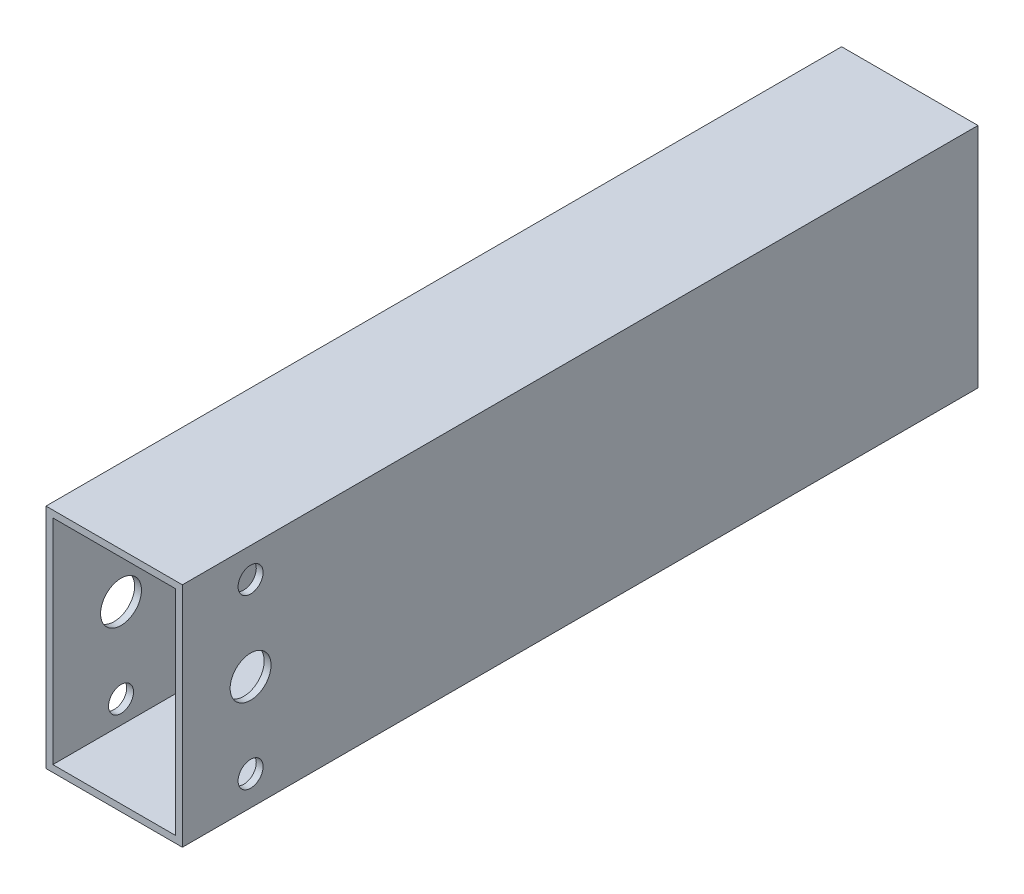
ISO-10303-21;
HEADER;
FILE_DESCRIPTION(('STEP AP214'),'2;1');
FILE_NAME('part.step','',(''),(''),'','','');
FILE_SCHEMA(('AUTOMOTIVE_DESIGN { 1 0 10303 214 1 1 1 1 }'));
ENDSEC;
DATA;
#1=APPLICATION_CONTEXT('core data for automotive mechanical design processes');
#2=APPLICATION_PROTOCOL_DEFINITION('international standard','automotive_design',2000,#1);
#3=PRODUCT_CONTEXT('',#1,'mechanical');
#4=PRODUCT('Part','Part','',(#3));
#5=PRODUCT_RELATED_PRODUCT_CATEGORY('part','',(#4));
#6=PRODUCT_DEFINITION_FORMATION('','',#4);
#7=PRODUCT_DEFINITION_CONTEXT('part definition',#1,'design');
#8=PRODUCT_DEFINITION('design','',#6,#7);
#9=PRODUCT_DEFINITION_SHAPE('','',#8);
#10=(LENGTH_UNIT() NAMED_UNIT(*) SI_UNIT(.MILLI.,.METRE.));
#11=(NAMED_UNIT(*) PLANE_ANGLE_UNIT() SI_UNIT($,.RADIAN.));
#12=(NAMED_UNIT(*) SI_UNIT($,.STERADIAN.) SOLID_ANGLE_UNIT());
#13=UNCERTAINTY_MEASURE_WITH_UNIT(LENGTH_MEASURE(1.E-05),#10,'distance_accuracy_value','');
#14=(GEOMETRIC_REPRESENTATION_CONTEXT(3) GLOBAL_UNCERTAINTY_ASSIGNED_CONTEXT((#13)) GLOBAL_UNIT_ASSIGNED_CONTEXT((#10,
#11,#12)) REPRESENTATION_CONTEXT('',''));
#15=CARTESIAN_POINT('',(0.,0.,0.));
#16=DIRECTION('',(0.,0.,1.));
#17=DIRECTION('',(1.,0.,0.));
#18=AXIS2_PLACEMENT_3D('',#15,#16,#17);
#19=CARTESIAN_POINT('',(0.,0.,175.));
#20=DIRECTION('',(0.,0.,-1.));
#21=DIRECTION('',(-1.,0.,0.));
#22=AXIS2_PLACEMENT_3D('',#19,#20,#21);
#23=PLANE('',#22);
#24=DIRECTION('',(0.,-1.,0.));
#25=VECTOR('',#24,1.);
#26=CARTESIAN_POINT('',(0.,0.,175.));
#27=LINE('',#26,#25);
#28=CARTESIAN_POINT('',(0.,50.,175.));
#29=VERTEX_POINT('',#28);
#30=CARTESIAN_POINT('',(0.,0.,175.));
#31=VERTEX_POINT('',#30);
#32=EDGE_CURVE('E140',#29,#31,#27,.T.);
#33=ORIENTED_EDGE('',*,*,#32,.T.);
#34=DIRECTION('',(1.,0.,0.));
#35=VECTOR('',#34,1.);
#36=CARTESIAN_POINT('',(0.,0.,175.));
#37=LINE('',#36,#35);
#38=CARTESIAN_POINT('',(30.,0.,175.));
#39=VERTEX_POINT('',#38);
#40=EDGE_CURVE('E143',#31,#39,#37,.T.);
#41=ORIENTED_EDGE('',*,*,#40,.T.);
#42=DIRECTION('',(0.,1.,0.));
#43=VECTOR('',#42,1.);
#44=CARTESIAN_POINT('',(30.,0.,175.));
#45=LINE('',#44,#43);
#46=CARTESIAN_POINT('',(30.,50.,175.));
#47=VERTEX_POINT('',#46);
#48=EDGE_CURVE('E146',#39,#47,#45,.T.);
#49=ORIENTED_EDGE('',*,*,#48,.T.);
#50=DIRECTION('',(-1.,0.,0.));
#51=VECTOR('',#50,1.);
#52=CARTESIAN_POINT('',(0.,50.,175.));
#53=LINE('',#52,#51);
#54=EDGE_CURVE('E148',#47,#29,#53,.T.);
#55=ORIENTED_EDGE('',*,*,#54,.T.);
#56=EDGE_LOOP('',(#33,#41,#49,#55));
#57=FACE_BOUND('',#56,.T.);
#58=DIRECTION('',(0.,-1.,0.));
#59=VECTOR('',#58,1.);
#60=CARTESIAN_POINT('',(1.5,1.5,175.));
#61=LINE('',#60,#59);
#62=CARTESIAN_POINT('',(1.5,48.5,175.));
#63=VERTEX_POINT('',#62);
#64=CARTESIAN_POINT('',(1.5,1.5,175.));
#65=VERTEX_POINT('',#64);
#66=EDGE_CURVE('E102',#63,#65,#61,.T.);
#67=ORIENTED_EDGE('',*,*,#66,.F.);
#68=DIRECTION('',(-1.,0.,0.));
#69=VECTOR('',#68,1.);
#70=CARTESIAN_POINT('',(1.5,48.5,175.));
#71=LINE('',#70,#69);
#72=CARTESIAN_POINT('',(28.5,48.5,175.));
#73=VERTEX_POINT('',#72);
#74=EDGE_CURVE('E124',#73,#63,#71,.T.);
#75=ORIENTED_EDGE('',*,*,#74,.F.);
#76=DIRECTION('',(0.,1.,0.));
#77=VECTOR('',#76,1.);
#78=CARTESIAN_POINT('',(28.5,1.5,175.));
#79=LINE('',#78,#77);
#80=CARTESIAN_POINT('',(28.5,1.5,175.));
#81=VERTEX_POINT('',#80);
#82=EDGE_CURVE('E122',#81,#73,#79,.T.);
#83=ORIENTED_EDGE('',*,*,#82,.F.);
#84=DIRECTION('',(1.,0.,0.));
#85=VECTOR('',#84,1.);
#86=CARTESIAN_POINT('',(1.5,1.5,175.));
#87=LINE('',#86,#85);
#88=EDGE_CURVE('E110',#65,#81,#87,.T.);
#89=ORIENTED_EDGE('',*,*,#88,.F.);
#90=EDGE_LOOP('',(#67,#75,#83,#89));
#91=FACE_BOUND('',#90,.T.);
#92=ADVANCED_FACE('F35',(#57,#91),#23,.F.);
#93=CARTESIAN_POINT('',(0.,0.,0.));
#94=DIRECTION('',(0.,0.,-1.));
#95=DIRECTION('',(-1.,0.,0.));
#96=AXIS2_PLACEMENT_3D('',#93,#94,#95);
#97=PLANE('',#96);
#98=DIRECTION('',(0.,-1.,0.));
#99=VECTOR('',#98,1.);
#100=CARTESIAN_POINT('',(0.,0.,0.));
#101=LINE('',#100,#99);
#102=CARTESIAN_POINT('',(0.,50.,0.));
#103=VERTEX_POINT('',#102);
#104=CARTESIAN_POINT('',(0.,0.,0.));
#105=VERTEX_POINT('',#104);
#106=EDGE_CURVE('E118',#103,#105,#101,.T.);
#107=ORIENTED_EDGE('',*,*,#106,.F.);
#108=DIRECTION('',(-1.,0.,0.));
#109=VECTOR('',#108,1.);
#110=CARTESIAN_POINT('',(0.,50.,0.));
#111=LINE('',#110,#109);
#112=CARTESIAN_POINT('',(30.,50.,0.));
#113=VERTEX_POINT('',#112);
#114=EDGE_CURVE('E144',#113,#103,#111,.T.);
#115=ORIENTED_EDGE('',*,*,#114,.F.);
#116=DIRECTION('',(0.,1.,0.));
#117=VECTOR('',#116,1.);
#118=CARTESIAN_POINT('',(30.,0.,0.));
#119=LINE('',#118,#117);
#120=CARTESIAN_POINT('',(30.,0.,0.));
#121=VERTEX_POINT('',#120);
#122=EDGE_CURVE('E155',#121,#113,#119,.T.);
#123=ORIENTED_EDGE('',*,*,#122,.F.);
#124=DIRECTION('',(1.,0.,0.));
#125=VECTOR('',#124,1.);
#126=CARTESIAN_POINT('',(0.,0.,0.));
#127=LINE('',#126,#125);
#128=EDGE_CURVE('E153',#105,#121,#127,.T.);
#129=ORIENTED_EDGE('',*,*,#128,.F.);
#130=EDGE_LOOP('',(#107,#115,#123,#129));
#131=FACE_BOUND('',#130,.T.);
#132=DIRECTION('',(-1.,0.,0.));
#133=VECTOR('',#132,1.);
#134=CARTESIAN_POINT('',(1.5,48.5,0.));
#135=LINE('',#134,#133);
#136=CARTESIAN_POINT('',(28.5,48.5,0.));
#137=VERTEX_POINT('',#136);
#138=CARTESIAN_POINT('',(1.5,48.5,0.));
#139=VERTEX_POINT('',#138);
#140=EDGE_CURVE('E111',#137,#139,#135,.T.);
#141=ORIENTED_EDGE('',*,*,#140,.T.);
#142=DIRECTION('',(0.,-1.,0.));
#143=VECTOR('',#142,1.);
#144=CARTESIAN_POINT('',(1.5,1.5,0.));
#145=LINE('',#144,#143);
#146=CARTESIAN_POINT('',(1.5,1.5,0.));
#147=VERTEX_POINT('',#146);
#148=EDGE_CURVE('E60',#139,#147,#145,.T.);
#149=ORIENTED_EDGE('',*,*,#148,.T.);
#150=DIRECTION('',(1.,0.,0.));
#151=VECTOR('',#150,1.);
#152=CARTESIAN_POINT('',(1.5,1.5,0.));
#153=LINE('',#152,#151);
#154=CARTESIAN_POINT('',(28.5,1.5,0.));
#155=VERTEX_POINT('',#154);
#156=EDGE_CURVE('E117',#147,#155,#153,.T.);
#157=ORIENTED_EDGE('',*,*,#156,.T.);
#158=DIRECTION('',(0.,1.,0.));
#159=VECTOR('',#158,1.);
#160=CARTESIAN_POINT('',(28.5,1.5,0.));
#161=LINE('',#160,#159);
#162=EDGE_CURVE('E132',#155,#137,#161,.T.);
#163=ORIENTED_EDGE('',*,*,#162,.T.);
#164=EDGE_LOOP('',(#141,#149,#157,#163));
#165=FACE_BOUND('',#164,.T.);
#166=ADVANCED_FACE('F213',(#131,#165),#97,.T.);
#167=CARTESIAN_POINT('',(0.,0.,175.));
#168=DIRECTION('',(1.,0.,0.));
#169=DIRECTION('',(0.,0.,-1.));
#170=AXIS2_PLACEMENT_3D('',#167,#168,#169);
#171=PLANE('',#170);
#172=CARTESIAN_POINT('',(0.,25.,160.));
#173=DIRECTION('',(1.,0.,0.));
#174=DIRECTION('',(0.,0.,-1.));
#175=AXIS2_PLACEMENT_3D('',#172,#173,#174);
#176=CIRCLE('',#175,4.49999999999999);
#177=CARTESIAN_POINT('',(0.,25.,155.5));
#178=VERTEX_POINT('',#177);
#179=EDGE_CURVE('E277',#178,#178,#176,.T.);
#180=ORIENTED_EDGE('',*,*,#179,.T.);
#181=EDGE_LOOP('',(#180));
#182=FACE_BOUND('',#181,.T.);
#183=CARTESIAN_POINT('',(0.,43.5,160.));
#184=DIRECTION('',(1.,0.,0.));
#185=DIRECTION('',(0.,0.,-1.));
#186=AXIS2_PLACEMENT_3D('',#183,#184,#185);
#187=CIRCLE('',#186,2.75);
#188=CARTESIAN_POINT('',(0.,43.5,157.25));
#189=VERTEX_POINT('',#188);
#190=EDGE_CURVE('E171',#189,#189,#187,.T.);
#191=ORIENTED_EDGE('',*,*,#190,.T.);
#192=EDGE_LOOP('',(#191));
#193=FACE_BOUND('',#192,.T.);
#194=CARTESIAN_POINT('',(0.,6.50000000000001,160.));
#195=DIRECTION('',(1.,0.,0.));
#196=DIRECTION('',(0.,0.,-1.));
#197=AXIS2_PLACEMENT_3D('',#194,#195,#196);
#198=CIRCLE('',#197,2.74999999999999);
#199=CARTESIAN_POINT('',(0.,6.50000000000001,157.25));
#200=VERTEX_POINT('',#199);
#201=EDGE_CURVE('E167',#200,#200,#198,.T.);
#202=ORIENTED_EDGE('',*,*,#201,.T.);
#203=EDGE_LOOP('',(#202));
#204=FACE_BOUND('',#203,.T.);
#205=ORIENTED_EDGE('',*,*,#106,.T.);
#206=DIRECTION('',(0.,0.,-1.));
#207=VECTOR('',#206,1.);
#208=CARTESIAN_POINT('',(0.,0.,175.));
#209=LINE('',#208,#207);
#210=EDGE_CURVE('E11',#31,#105,#209,.T.);
#211=ORIENTED_EDGE('',*,*,#210,.F.);
#212=ORIENTED_EDGE('',*,*,#32,.F.);
#213=DIRECTION('',(0.,0.,-1.));
#214=VECTOR('',#213,1.);
#215=CARTESIAN_POINT('',(0.,50.,175.));
#216=LINE('',#215,#214);
#217=EDGE_CURVE('E150',#29,#103,#216,.T.);
#218=ORIENTED_EDGE('',*,*,#217,.T.);
#219=EDGE_LOOP('',(#205,#211,#212,#218));
#220=FACE_BOUND('',#219,.T.);
#221=ADVANCED_FACE('F37',(#182,#193,#204,#220),#171,.F.);
#222=CARTESIAN_POINT('',(0.,0.,175.));
#223=DIRECTION('',(0.,1.,0.));
#224=DIRECTION('',(0.,0.,1.));
#225=AXIS2_PLACEMENT_3D('',#222,#223,#224);
#226=PLANE('',#225);
#227=ORIENTED_EDGE('',*,*,#128,.T.);
#228=DIRECTION('',(0.,0.,-1.));
#229=VECTOR('',#228,1.);
#230=CARTESIAN_POINT('',(30.,0.,175.));
#231=LINE('',#230,#229);
#232=EDGE_CURVE('E44',#39,#121,#231,.T.);
#233=ORIENTED_EDGE('',*,*,#232,.F.);
#234=ORIENTED_EDGE('',*,*,#40,.F.);
#235=ORIENTED_EDGE('',*,*,#210,.T.);
#236=EDGE_LOOP('',(#227,#233,#234,#235));
#237=FACE_BOUND('',#236,.T.);
#238=ADVANCED_FACE('F222',(#237),#226,.F.);
#239=CARTESIAN_POINT('',(30.,0.,175.));
#240=DIRECTION('',(-1.,0.,0.));
#241=DIRECTION('',(0.,0.,1.));
#242=AXIS2_PLACEMENT_3D('',#239,#240,#241);
#243=PLANE('',#242);
#244=CARTESIAN_POINT('',(30.,25.,160.));
#245=DIRECTION('',(1.,0.,0.));
#246=DIRECTION('',(0.,0.,-1.));
#247=AXIS2_PLACEMENT_3D('',#244,#245,#246);
#248=CIRCLE('',#247,4.5);
#249=CARTESIAN_POINT('',(30.,25.,155.5));
#250=VERTEX_POINT('',#249);
#251=EDGE_CURVE('E276',#250,#250,#248,.T.);
#252=ORIENTED_EDGE('',*,*,#251,.F.);
#253=EDGE_LOOP('',(#252));
#254=FACE_BOUND('',#253,.T.);
#255=CARTESIAN_POINT('',(30.,43.5,160.));
#256=DIRECTION('',(1.,0.,0.));
#257=DIRECTION('',(0.,0.,-1.));
#258=AXIS2_PLACEMENT_3D('',#255,#256,#257);
#259=CIRCLE('',#258,2.75);
#260=CARTESIAN_POINT('',(30.,43.5,157.25));
#261=VERTEX_POINT('',#260);
#262=EDGE_CURVE('E178',#261,#261,#259,.T.);
#263=ORIENTED_EDGE('',*,*,#262,.F.);
#264=EDGE_LOOP('',(#263));
#265=FACE_BOUND('',#264,.T.);
#266=CARTESIAN_POINT('',(30.,6.50000000000001,160.));
#267=DIRECTION('',(1.,0.,0.));
#268=DIRECTION('',(0.,0.,-1.));
#269=AXIS2_PLACEMENT_3D('',#266,#267,#268);
#270=CIRCLE('',#269,2.75);
#271=CARTESIAN_POINT('',(30.,6.50000000000001,157.25));
#272=VERTEX_POINT('',#271);
#273=EDGE_CURVE('E175',#272,#272,#270,.T.);
#274=ORIENTED_EDGE('',*,*,#273,.F.);
#275=EDGE_LOOP('',(#274));
#276=FACE_BOUND('',#275,.T.);
#277=ORIENTED_EDGE('',*,*,#122,.T.);
#278=DIRECTION('',(0.,0.,-1.));
#279=VECTOR('',#278,1.);
#280=CARTESIAN_POINT('',(30.,50.,175.));
#281=LINE('',#280,#279);
#282=EDGE_CURVE('E160',#47,#113,#281,.T.);
#283=ORIENTED_EDGE('',*,*,#282,.F.);
#284=ORIENTED_EDGE('',*,*,#48,.F.);
#285=ORIENTED_EDGE('',*,*,#232,.T.);
#286=EDGE_LOOP('',(#277,#283,#284,#285));
#287=FACE_BOUND('',#286,.T.);
#288=ADVANCED_FACE('F206',(#254,#265,#276,#287),#243,.F.);
#289=CARTESIAN_POINT('',(0.,50.,175.));
#290=DIRECTION('',(0.,-1.,0.));
#291=DIRECTION('',(0.,0.,-1.));
#292=AXIS2_PLACEMENT_3D('',#289,#290,#291);
#293=PLANE('',#292);
#294=ORIENTED_EDGE('',*,*,#114,.T.);
#295=ORIENTED_EDGE('',*,*,#217,.F.);
#296=ORIENTED_EDGE('',*,*,#54,.F.);
#297=ORIENTED_EDGE('',*,*,#282,.T.);
#298=EDGE_LOOP('',(#294,#295,#296,#297));
#299=FACE_BOUND('',#298,.T.);
#300=ADVANCED_FACE('F197',(#299),#293,.F.);
#301=CARTESIAN_POINT('',(1.5,1.5,175.));
#302=DIRECTION('',(1.,0.,0.));
#303=DIRECTION('',(0.,0.,-1.));
#304=AXIS2_PLACEMENT_3D('',#301,#302,#303);
#305=PLANE('',#304);
#306=CARTESIAN_POINT('',(1.5,25.,160.));
#307=DIRECTION('',(1.,0.,0.));
#308=DIRECTION('',(0.,0.,-1.));
#309=AXIS2_PLACEMENT_3D('',#306,#307,#308);
#310=CIRCLE('',#309,4.5);
#311=CARTESIAN_POINT('',(1.5,25.,155.5));
#312=VERTEX_POINT('',#311);
#313=EDGE_CURVE('E183',#312,#312,#310,.T.);
#314=ORIENTED_EDGE('',*,*,#313,.F.);
#315=EDGE_LOOP('',(#314));
#316=FACE_BOUND('',#315,.T.);
#317=CARTESIAN_POINT('',(1.5,43.5,160.));
#318=DIRECTION('',(1.,0.,0.));
#319=DIRECTION('',(0.,0.,-1.));
#320=AXIS2_PLACEMENT_3D('',#317,#318,#319);
#321=CIRCLE('',#320,2.75);
#322=CARTESIAN_POINT('',(1.5,43.5,157.25));
#323=VERTEX_POINT('',#322);
#324=EDGE_CURVE('E168',#323,#323,#321,.T.);
#325=ORIENTED_EDGE('',*,*,#324,.F.);
#326=EDGE_LOOP('',(#325));
#327=FACE_BOUND('',#326,.T.);
#328=CARTESIAN_POINT('',(1.5,6.50000000000001,160.));
#329=DIRECTION('',(1.,0.,0.));
#330=DIRECTION('',(0.,0.,-1.));
#331=AXIS2_PLACEMENT_3D('',#328,#329,#330);
#332=CIRCLE('',#331,2.74999999999999);
#333=CARTESIAN_POINT('',(1.5,6.50000000000001,157.25));
#334=VERTEX_POINT('',#333);
#335=EDGE_CURVE('E130',#334,#334,#332,.T.);
#336=ORIENTED_EDGE('',*,*,#335,.F.);
#337=EDGE_LOOP('',(#336));
#338=FACE_BOUND('',#337,.T.);
#339=ORIENTED_EDGE('',*,*,#148,.F.);
#340=DIRECTION('',(0.,0.,-1.));
#341=VECTOR('',#340,1.);
#342=CARTESIAN_POINT('',(1.5,48.5,175.));
#343=LINE('',#342,#341);
#344=EDGE_CURVE('E106',#63,#139,#343,.T.);
#345=ORIENTED_EDGE('',*,*,#344,.F.);
#346=ORIENTED_EDGE('',*,*,#66,.T.);
#347=DIRECTION('',(0.,0.,-1.));
#348=VECTOR('',#347,1.);
#349=CARTESIAN_POINT('',(1.5,1.5,175.));
#350=LINE('',#349,#348);
#351=EDGE_CURVE('E105',#65,#147,#350,.T.);
#352=ORIENTED_EDGE('',*,*,#351,.T.);
#353=EDGE_LOOP('',(#339,#345,#346,#352));
#354=FACE_BOUND('',#353,.T.);
#355=ADVANCED_FACE('F104',(#316,#327,#338,#354),#305,.T.);
#356=CARTESIAN_POINT('',(1.5,1.5,175.));
#357=DIRECTION('',(0.,1.,0.));
#358=DIRECTION('',(-1.,0.,0.));
#359=AXIS2_PLACEMENT_3D('',#356,#357,#358);
#360=PLANE('',#359);
#361=ORIENTED_EDGE('',*,*,#156,.F.);
#362=ORIENTED_EDGE('',*,*,#351,.F.);
#363=ORIENTED_EDGE('',*,*,#88,.T.);
#364=DIRECTION('',(0.,0.,-1.));
#365=VECTOR('',#364,1.);
#366=CARTESIAN_POINT('',(28.5,1.5,175.));
#367=LINE('',#366,#365);
#368=EDGE_CURVE('E119',#81,#155,#367,.T.);
#369=ORIENTED_EDGE('',*,*,#368,.T.);
#370=EDGE_LOOP('',(#361,#362,#363,#369));
#371=FACE_BOUND('',#370,.T.);
#372=ADVANCED_FACE('F114',(#371),#360,.T.);
#373=CARTESIAN_POINT('',(28.5,1.5,175.));
#374=DIRECTION('',(-1.,0.,0.));
#375=DIRECTION('',(0.,0.,1.));
#376=AXIS2_PLACEMENT_3D('',#373,#374,#375);
#377=PLANE('',#376);
#378=CARTESIAN_POINT('',(28.5,25.,160.));
#379=DIRECTION('',(-1.,0.,0.));
#380=DIRECTION('',(0.,0.,1.));
#381=AXIS2_PLACEMENT_3D('',#378,#379,#380);
#382=CIRCLE('',#381,4.5);
#383=CARTESIAN_POINT('',(28.5,25.,164.5));
#384=VERTEX_POINT('',#383);
#385=EDGE_CURVE('E39',#384,#384,#382,.T.);
#386=ORIENTED_EDGE('',*,*,#385,.F.);
#387=EDGE_LOOP('',(#386));
#388=FACE_BOUND('',#387,.T.);
#389=CARTESIAN_POINT('',(28.5,43.5,160.));
#390=DIRECTION('',(-1.,0.,0.));
#391=DIRECTION('',(0.,0.,1.));
#392=AXIS2_PLACEMENT_3D('',#389,#390,#391);
#393=CIRCLE('',#392,2.75);
#394=CARTESIAN_POINT('',(28.5,43.5,162.75));
#395=VERTEX_POINT('',#394);
#396=EDGE_CURVE('E170',#395,#395,#393,.T.);
#397=ORIENTED_EDGE('',*,*,#396,.F.);
#398=EDGE_LOOP('',(#397));
#399=FACE_BOUND('',#398,.T.);
#400=CARTESIAN_POINT('',(28.5,6.50000000000001,160.));
#401=DIRECTION('',(-1.,0.,0.));
#402=DIRECTION('',(0.,0.,1.));
#403=AXIS2_PLACEMENT_3D('',#400,#401,#402);
#404=CIRCLE('',#403,2.74999999999999);
#405=CARTESIAN_POINT('',(28.5,6.50000000000001,162.75));
#406=VERTEX_POINT('',#405);
#407=EDGE_CURVE('E165',#406,#406,#404,.T.);
#408=ORIENTED_EDGE('',*,*,#407,.F.);
#409=EDGE_LOOP('',(#408));
#410=FACE_BOUND('',#409,.T.);
#411=ORIENTED_EDGE('',*,*,#162,.F.);
#412=ORIENTED_EDGE('',*,*,#368,.F.);
#413=ORIENTED_EDGE('',*,*,#82,.T.);
#414=DIRECTION('',(0.,0.,-1.));
#415=VECTOR('',#414,1.);
#416=CARTESIAN_POINT('',(28.5,48.5,175.));
#417=LINE('',#416,#415);
#418=EDGE_CURVE('E52',#73,#137,#417,.T.);
#419=ORIENTED_EDGE('',*,*,#418,.T.);
#420=EDGE_LOOP('',(#411,#412,#413,#419));
#421=FACE_BOUND('',#420,.T.);
#422=ADVANCED_FACE('F204',(#388,#399,#410,#421),#377,.T.);
#423=CARTESIAN_POINT('',(1.5,48.5,175.));
#424=DIRECTION('',(0.,-1.,0.));
#425=DIRECTION('',(0.,0.,-1.));
#426=AXIS2_PLACEMENT_3D('',#423,#424,#425);
#427=PLANE('',#426);
#428=ORIENTED_EDGE('',*,*,#140,.F.);
#429=ORIENTED_EDGE('',*,*,#418,.F.);
#430=ORIENTED_EDGE('',*,*,#74,.T.);
#431=ORIENTED_EDGE('',*,*,#344,.T.);
#432=EDGE_LOOP('',(#428,#429,#430,#431));
#433=FACE_BOUND('',#432,.T.);
#434=ADVANCED_FACE('F244',(#433),#427,.T.);
#435=CARTESIAN_POINT('',(30.,6.50000000000001,160.));
#436=DIRECTION('',(1.,0.,0.));
#437=DIRECTION('',(0.,0.,-1.));
#438=AXIS2_PLACEMENT_3D('',#435,#436,#437);
#439=CYLINDRICAL_SURFACE('',#438,2.74999999999999);
#440=ORIENTED_EDGE('',*,*,#407,.T.);
#441=EDGE_LOOP('',(#440));
#442=FACE_BOUND('',#441,.T.);
#443=ORIENTED_EDGE('',*,*,#273,.T.);
#444=EDGE_LOOP('',(#443));
#445=FACE_BOUND('',#444,.T.);
#446=ADVANCED_FACE('F246',(#442,#445),#439,.F.);
#447=ORIENTED_EDGE('',*,*,#335,.T.);
#448=EDGE_LOOP('',(#447));
#449=FACE_BOUND('',#448,.T.);
#450=ORIENTED_EDGE('',*,*,#201,.F.);
#451=EDGE_LOOP('',(#450));
#452=FACE_BOUND('',#451,.T.);
#453=ADVANCED_FACE('F193',(#449,#452),#439,.F.);
#454=CARTESIAN_POINT('',(30.,43.5,160.));
#455=DIRECTION('',(1.,0.,0.));
#456=DIRECTION('',(0.,0.,-1.));
#457=AXIS2_PLACEMENT_3D('',#454,#455,#456);
#458=CYLINDRICAL_SURFACE('',#457,2.75);
#459=ORIENTED_EDGE('',*,*,#324,.T.);
#460=EDGE_LOOP('',(#459));
#461=FACE_BOUND('',#460,.T.);
#462=ORIENTED_EDGE('',*,*,#190,.F.);
#463=EDGE_LOOP('',(#462));
#464=FACE_BOUND('',#463,.T.);
#465=ADVANCED_FACE('F257',(#461,#464),#458,.F.);
#466=ORIENTED_EDGE('',*,*,#396,.T.);
#467=EDGE_LOOP('',(#466));
#468=FACE_BOUND('',#467,.T.);
#469=ORIENTED_EDGE('',*,*,#262,.T.);
#470=EDGE_LOOP('',(#469));
#471=FACE_BOUND('',#470,.T.);
#472=ADVANCED_FACE('F260',(#468,#471),#458,.F.);
#473=CARTESIAN_POINT('',(30.,25.,160.));
#474=DIRECTION('',(1.,0.,0.));
#475=DIRECTION('',(0.,0.,-1.));
#476=AXIS2_PLACEMENT_3D('',#473,#474,#475);
#477=CYLINDRICAL_SURFACE('',#476,4.5);
#478=ORIENTED_EDGE('',*,*,#385,.T.);
#479=EDGE_LOOP('',(#478));
#480=FACE_BOUND('',#479,.T.);
#481=ORIENTED_EDGE('',*,*,#251,.T.);
#482=EDGE_LOOP('',(#481));
#483=FACE_BOUND('',#482,.T.);
#484=ADVANCED_FACE('F261',(#480,#483),#477,.F.);
#485=ORIENTED_EDGE('',*,*,#313,.T.);
#486=EDGE_LOOP('',(#485));
#487=FACE_BOUND('',#486,.T.);
#488=ORIENTED_EDGE('',*,*,#179,.F.);
#489=EDGE_LOOP('',(#488));
#490=FACE_BOUND('',#489,.T.);
#491=ADVANCED_FACE('F263',(#487,#490),#477,.F.);
#492=CLOSED_SHELL('',(#92,#166,#221,#238,#288,#300,#355,#372,#422,#434,#446,#453,#465,#472,#484,#491));
#493=MANIFOLD_SOLID_BREP('B2',#492);
#494=ADVANCED_BREP_SHAPE_REPRESENTATION('',(#18,#493),#14);
#495=SHAPE_DEFINITION_REPRESENTATION(#9,#494);
ENDSEC;
END-ISO-10303-21;
